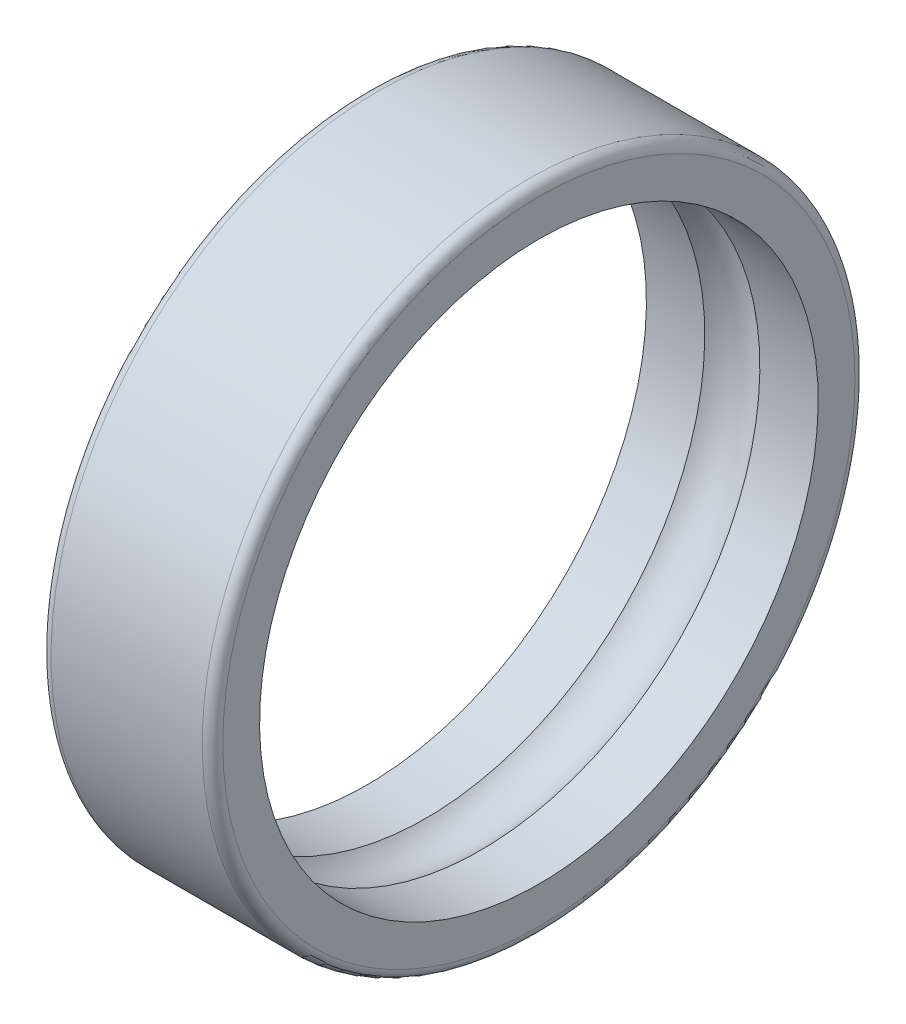
ISO-10303-21;
HEADER;
FILE_DESCRIPTION(('STEP AP214'),'2;1');
FILE_NAME('part.step','',(''),(''),'','','');
FILE_SCHEMA(('AUTOMOTIVE_DESIGN { 1 0 10303 214 1 1 1 1 }'));
ENDSEC;
DATA;
#1=APPLICATION_CONTEXT('core data for automotive mechanical design processes');
#2=APPLICATION_PROTOCOL_DEFINITION('international standard','automotive_design',2000,#1);
#3=PRODUCT_CONTEXT('',#1,'mechanical');
#4=PRODUCT('Part','Part','',(#3));
#5=PRODUCT_RELATED_PRODUCT_CATEGORY('part','',(#4));
#6=PRODUCT_DEFINITION_FORMATION('','',#4);
#7=PRODUCT_DEFINITION_CONTEXT('part definition',#1,'design');
#8=PRODUCT_DEFINITION('design','',#6,#7);
#9=PRODUCT_DEFINITION_SHAPE('','',#8);
#10=(LENGTH_UNIT() NAMED_UNIT(*) SI_UNIT(.MILLI.,.METRE.));
#11=(NAMED_UNIT(*) PLANE_ANGLE_UNIT() SI_UNIT($,.RADIAN.));
#12=(NAMED_UNIT(*) SI_UNIT($,.STERADIAN.) SOLID_ANGLE_UNIT());
#13=UNCERTAINTY_MEASURE_WITH_UNIT(LENGTH_MEASURE(1.E-05),#10,'distance_accuracy_value','');
#14=(GEOMETRIC_REPRESENTATION_CONTEXT(3) GLOBAL_UNCERTAINTY_ASSIGNED_CONTEXT((#13)) GLOBAL_UNIT_ASSIGNED_CONTEXT((#10,
#11,#12)) REPRESENTATION_CONTEXT('',''));
#15=CARTESIAN_POINT('',(0.,0.,0.));
#16=DIRECTION('',(0.,0.,1.));
#17=DIRECTION('',(1.,0.,0.));
#18=AXIS2_PLACEMENT_3D('',#15,#16,#17);
#19=CARTESIAN_POINT('',(4.1509021857012,0.,0.));
#20=DIRECTION('',(-1.,0.,0.));
#21=DIRECTION('',(0.,1.,0.));
#22=AXIS2_PLACEMENT_3D('',#19,#20,#21);
#23=CYLINDRICAL_SURFACE('',#22,8.13);
#24=CARTESIAN_POINT('',(5.,0.,0.));
#25=DIRECTION('',(1.,0.,0.));
#26=DIRECTION('',(0.,1.,0.));
#27=AXIS2_PLACEMENT_3D('',#24,#25,#26);
#28=CIRCLE('',#27,8.13);
#29=CARTESIAN_POINT('',(5.,8.13,0.));
#30=VERTEX_POINT('',#29);
#31=EDGE_CURVE('E11',#30,#30,#28,.T.);
#32=ORIENTED_EDGE('',*,*,#31,.T.);
#33=EDGE_LOOP('',(#32));
#34=FACE_BOUND('',#33,.T.);
#35=CARTESIAN_POINT('',(3.3018043714024,0.,0.));
#36=DIRECTION('',(1.,0.,0.));
#37=DIRECTION('',(0.,1.,0.));
#38=AXIS2_PLACEMENT_3D('',#35,#36,#37);
#39=CIRCLE('',#38,8.13);
#40=CARTESIAN_POINT('',(3.3018043714024,8.13,0.));
#41=VERTEX_POINT('',#40);
#42=EDGE_CURVE('E20',#41,#41,#39,.T.);
#43=ORIENTED_EDGE('',*,*,#42,.F.);
#44=EDGE_LOOP('',(#43));
#45=FACE_BOUND('',#44,.T.);
#46=ADVANCED_FACE('F16',(#34,#45),#23,.F.);
#47=CARTESIAN_POINT('',(5.,8.665,0.));
#48=DIRECTION('',(1.,0.,0.));
#49=DIRECTION('',(0.,1.,0.));
#50=AXIS2_PLACEMENT_3D('',#47,#48,#49);
#51=PLANE('',#50);
#52=CARTESIAN_POINT('',(5.,0.,0.));
#53=DIRECTION('',(1.,0.,0.));
#54=DIRECTION('',(0.,1.,0.));
#55=AXIS2_PLACEMENT_3D('',#52,#53,#54);
#56=CIRCLE('',#55,9.2);
#57=CARTESIAN_POINT('',(5.,9.2,0.));
#58=VERTEX_POINT('',#57);
#59=EDGE_CURVE('E26',#58,#58,#56,.T.);
#60=ORIENTED_EDGE('',*,*,#59,.T.);
#61=EDGE_LOOP('',(#60));
#62=FACE_BOUND('',#61,.T.);
#63=ORIENTED_EDGE('',*,*,#31,.F.);
#64=EDGE_LOOP('',(#63));
#65=FACE_BOUND('',#64,.T.);
#66=ADVANCED_FACE('F88',(#62,#65),#51,.T.);
#67=CARTESIAN_POINT('',(4.7,0.,0.));
#68=DIRECTION('',(1.,0.,0.));
#69=DIRECTION('',(0.,0.,-1.));
#70=AXIS2_PLACEMENT_3D('',#67,#68,#69);
#71=TOROIDAL_SURFACE('',#70,9.2,0.3);
#72=CARTESIAN_POINT('',(4.7,0.,0.));
#73=DIRECTION('',(1.,0.,0.));
#74=DIRECTION('',(0.,1.,0.));
#75=AXIS2_PLACEMENT_3D('',#72,#73,#74);
#76=CIRCLE('',#75,9.5);
#77=CARTESIAN_POINT('',(4.7,9.5,0.));
#78=VERTEX_POINT('',#77);
#79=EDGE_CURVE('E62',#78,#78,#76,.T.);
#80=ORIENTED_EDGE('',*,*,#79,.T.);
#81=EDGE_LOOP('',(#80));
#82=FACE_BOUND('',#81,.T.);
#83=ORIENTED_EDGE('',*,*,#59,.F.);
#84=EDGE_LOOP('',(#83));
#85=FACE_BOUND('',#84,.T.);
#86=ADVANCED_FACE('F92',(#82,#85),#71,.T.);
#87=CARTESIAN_POINT('',(2.5,0.,0.));
#88=DIRECTION('',(-1.,0.,0.));
#89=DIRECTION('',(0.,1.,0.));
#90=AXIS2_PLACEMENT_3D('',#87,#88,#89);
#91=CYLINDRICAL_SURFACE('',#90,9.5);
#92=CARTESIAN_POINT('',(0.3,0.,0.));
#93=DIRECTION('',(1.,0.,0.));
#94=DIRECTION('',(0.,1.,0.));
#95=AXIS2_PLACEMENT_3D('',#92,#93,#94);
#96=CIRCLE('',#95,9.5);
#97=CARTESIAN_POINT('',(0.3,9.5,0.));
#98=VERTEX_POINT('',#97);
#99=EDGE_CURVE('E59',#98,#98,#96,.T.);
#100=ORIENTED_EDGE('',*,*,#99,.T.);
#101=EDGE_LOOP('',(#100));
#102=FACE_BOUND('',#101,.T.);
#103=ORIENTED_EDGE('',*,*,#79,.F.);
#104=EDGE_LOOP('',(#103));
#105=FACE_BOUND('',#104,.T.);
#106=ADVANCED_FACE('F18',(#102,#105),#91,.T.);
#107=CARTESIAN_POINT('',(0.3,0.,0.));
#108=DIRECTION('',(1.,0.,0.));
#109=DIRECTION('',(0.,0.,-1.));
#110=AXIS2_PLACEMENT_3D('',#107,#108,#109);
#111=TOROIDAL_SURFACE('',#110,9.2,0.3);
#112=CARTESIAN_POINT('',(0.,0.,0.));
#113=DIRECTION('',(1.,0.,0.));
#114=DIRECTION('',(0.,1.,0.));
#115=AXIS2_PLACEMENT_3D('',#112,#113,#114);
#116=CIRCLE('',#115,9.2);
#117=CARTESIAN_POINT('',(0.,9.2,0.));
#118=VERTEX_POINT('',#117);
#119=EDGE_CURVE('E55',#118,#118,#116,.T.);
#120=ORIENTED_EDGE('',*,*,#119,.T.);
#121=EDGE_LOOP('',(#120));
#122=FACE_BOUND('',#121,.T.);
#123=ORIENTED_EDGE('',*,*,#99,.F.);
#124=EDGE_LOOP('',(#123));
#125=FACE_BOUND('',#124,.T.);
#126=ADVANCED_FACE('F84',(#122,#125),#111,.T.);
#127=CARTESIAN_POINT('',(0.,8.665,0.));
#128=DIRECTION('',(-1.,0.,0.));
#129=DIRECTION('',(0.,-1.,0.));
#130=AXIS2_PLACEMENT_3D('',#127,#128,#129);
#131=PLANE('',#130);
#132=CARTESIAN_POINT('',(0.,0.,0.));
#133=DIRECTION('',(1.,0.,0.));
#134=DIRECTION('',(0.,1.,0.));
#135=AXIS2_PLACEMENT_3D('',#132,#133,#134);
#136=CIRCLE('',#135,8.13);
#137=CARTESIAN_POINT('',(0.,8.13,0.));
#138=VERTEX_POINT('',#137);
#139=EDGE_CURVE('E65',#138,#138,#136,.T.);
#140=ORIENTED_EDGE('',*,*,#139,.T.);
#141=EDGE_LOOP('',(#140));
#142=FACE_BOUND('',#141,.T.);
#143=ORIENTED_EDGE('',*,*,#119,.F.);
#144=EDGE_LOOP('',(#143));
#145=FACE_BOUND('',#144,.T.);
#146=ADVANCED_FACE('F71',(#142,#145),#131,.T.);
#147=CARTESIAN_POINT('',(0.849097814298799,0.,0.));
#148=DIRECTION('',(-1.,0.,0.));
#149=DIRECTION('',(0.,1.,0.));
#150=AXIS2_PLACEMENT_3D('',#147,#148,#149);
#151=CYLINDRICAL_SURFACE('',#150,8.13);
#152=CARTESIAN_POINT('',(1.6981956285976,0.,0.));
#153=DIRECTION('',(1.,0.,0.));
#154=DIRECTION('',(0.,1.,0.));
#155=AXIS2_PLACEMENT_3D('',#152,#153,#154);
#156=CIRCLE('',#155,8.13);
#157=CARTESIAN_POINT('',(1.6981956285976,8.13,0.));
#158=VERTEX_POINT('',#157);
#159=EDGE_CURVE('E48',#158,#158,#156,.T.);
#160=ORIENTED_EDGE('',*,*,#159,.T.);
#161=EDGE_LOOP('',(#160));
#162=FACE_BOUND('',#161,.T.);
#163=ORIENTED_EDGE('',*,*,#139,.F.);
#164=EDGE_LOOP('',(#163));
#165=FACE_BOUND('',#164,.T.);
#166=ADVANCED_FACE('F74',(#162,#165),#151,.F.);
#167=CARTESIAN_POINT('',(2.5,0.,0.));
#168=DIRECTION('',(1.,0.,0.));
#169=DIRECTION('',(0.,0.,-1.));
#170=AXIS2_PLACEMENT_3D('',#167,#168,#169);
#171=TOROIDAL_SURFACE('',#170,7.25,1.1905);
#172=ORIENTED_EDGE('',*,*,#42,.T.);
#173=EDGE_LOOP('',(#172));
#174=FACE_BOUND('',#173,.T.);
#175=ORIENTED_EDGE('',*,*,#159,.F.);
#176=EDGE_LOOP('',(#175));
#177=FACE_BOUND('',#176,.T.);
#178=ADVANCED_FACE('F76',(#174,#177),#171,.F.);
#179=CLOSED_SHELL('',(#46,#66,#86,#106,#126,#146,#166,#178));
#180=MANIFOLD_SOLID_BREP('B1',#179);
#181=ADVANCED_BREP_SHAPE_REPRESENTATION('',(#18,#180),#14);
#182=SHAPE_DEFINITION_REPRESENTATION(#9,#181);
ENDSEC;
END-ISO-10303-21;
